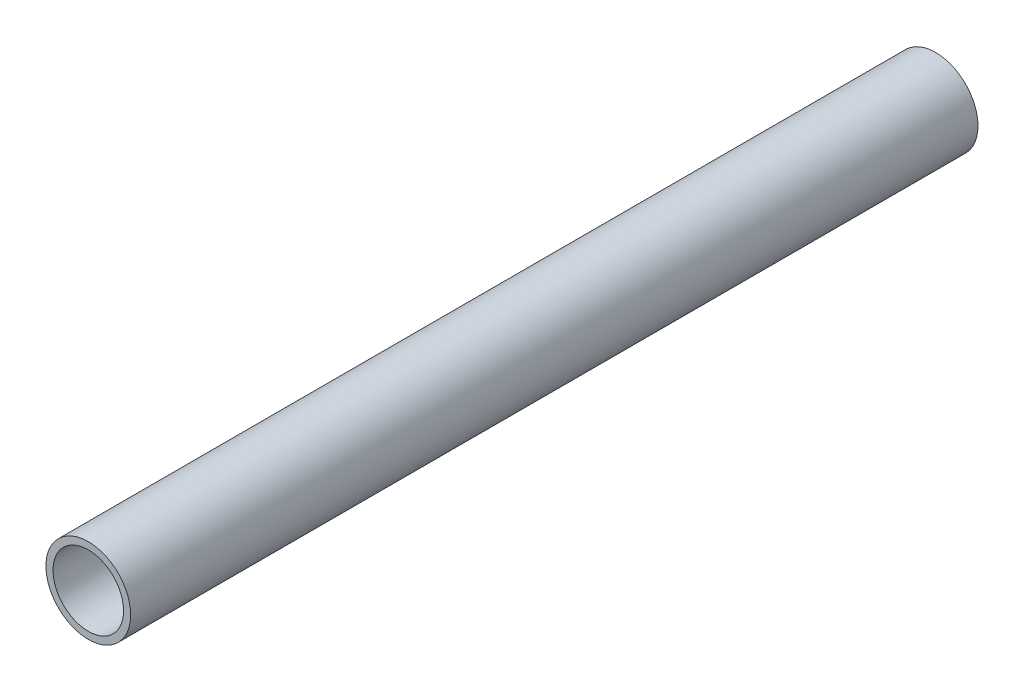
ISO-10303-21;
HEADER;
FILE_DESCRIPTION(('STEP AP214'),'2;1');
FILE_NAME('part.step','',(''),(''),'','','');
FILE_SCHEMA(('AUTOMOTIVE_DESIGN { 1 0 10303 214 1 1 1 1 }'));
ENDSEC;
DATA;
#1=APPLICATION_CONTEXT('core data for automotive mechanical design processes');
#2=APPLICATION_PROTOCOL_DEFINITION('international standard','automotive_design',2000,#1);
#3=PRODUCT_CONTEXT('',#1,'mechanical');
#4=PRODUCT('Part','Part','',(#3));
#5=PRODUCT_RELATED_PRODUCT_CATEGORY('part','',(#4));
#6=PRODUCT_DEFINITION_FORMATION('','',#4);
#7=PRODUCT_DEFINITION_CONTEXT('part definition',#1,'design');
#8=PRODUCT_DEFINITION('design','',#6,#7);
#9=PRODUCT_DEFINITION_SHAPE('','',#8);
#10=(LENGTH_UNIT() NAMED_UNIT(*) SI_UNIT(.MILLI.,.METRE.));
#11=(NAMED_UNIT(*) PLANE_ANGLE_UNIT() SI_UNIT($,.RADIAN.));
#12=(NAMED_UNIT(*) SI_UNIT($,.STERADIAN.) SOLID_ANGLE_UNIT());
#13=UNCERTAINTY_MEASURE_WITH_UNIT(LENGTH_MEASURE(1.E-05),#10,'distance_accuracy_value','');
#14=(GEOMETRIC_REPRESENTATION_CONTEXT(3) GLOBAL_UNCERTAINTY_ASSIGNED_CONTEXT((#13)) GLOBAL_UNIT_ASSIGNED_CONTEXT((#10,
#11,#12)) REPRESENTATION_CONTEXT('',''));
#15=CARTESIAN_POINT('',(0.,0.,0.));
#16=DIRECTION('',(0.,0.,1.));
#17=DIRECTION('',(1.,0.,0.));
#18=AXIS2_PLACEMENT_3D('',#15,#16,#17);
#19=CARTESIAN_POINT('',(63.2056093846233,81.64534440893,120.));
#20=DIRECTION('',(0.,0.,1.));
#21=DIRECTION('',(1.,0.,0.));
#22=AXIS2_PLACEMENT_3D('',#19,#20,#21);
#23=PLANE('',#22);
#24=CARTESIAN_POINT('',(63.2056093846233,81.64534440893,120.));
#25=DIRECTION('',(0.,0.,1.));
#26=DIRECTION('',(1.,0.,0.));
#27=AXIS2_PLACEMENT_3D('',#24,#25,#26);
#28=CIRCLE('',#27,6.);
#29=CARTESIAN_POINT('',(69.2056093846233,81.64534440893,120.));
#30=VERTEX_POINT('',#29);
#31=EDGE_CURVE('E10',#30,#30,#28,.T.);
#32=ORIENTED_EDGE('',*,*,#31,.T.);
#33=EDGE_LOOP('',(#32));
#34=FACE_BOUND('',#33,.T.);
#35=CARTESIAN_POINT('',(63.2056093846233,81.64534440893,120.));
#36=DIRECTION('',(0.,0.,1.));
#37=DIRECTION('',(1.,0.,0.));
#38=AXIS2_PLACEMENT_3D('',#35,#36,#37);
#39=CIRCLE('',#38,5.00000000000001);
#40=CARTESIAN_POINT('',(68.2056093846233,81.64534440893,120.));
#41=VERTEX_POINT('',#40);
#42=EDGE_CURVE('E43',#41,#41,#39,.T.);
#43=ORIENTED_EDGE('',*,*,#42,.F.);
#44=EDGE_LOOP('',(#43));
#45=FACE_BOUND('',#44,.T.);
#46=ADVANCED_FACE('F32',(#34,#45),#23,.T.);
#47=CARTESIAN_POINT('',(63.2056093846233,81.64534440893,0.));
#48=DIRECTION('',(0.,0.,1.));
#49=DIRECTION('',(1.,0.,0.));
#50=AXIS2_PLACEMENT_3D('',#47,#48,#49);
#51=PLANE('',#50);
#52=CARTESIAN_POINT('',(63.2056093846233,81.64534440893,0.));
#53=DIRECTION('',(0.,0.,1.));
#54=DIRECTION('',(1.,0.,0.));
#55=AXIS2_PLACEMENT_3D('',#52,#53,#54);
#56=CIRCLE('',#55,6.);
#57=CARTESIAN_POINT('',(69.2056093846233,81.64534440893,0.));
#58=VERTEX_POINT('',#57);
#59=EDGE_CURVE('E36',#58,#58,#56,.T.);
#60=ORIENTED_EDGE('',*,*,#59,.F.);
#61=EDGE_LOOP('',(#60));
#62=FACE_BOUND('',#61,.T.);
#63=CARTESIAN_POINT('',(63.2056093846233,81.64534440893,0.));
#64=DIRECTION('',(0.,0.,1.));
#65=DIRECTION('',(1.,0.,0.));
#66=AXIS2_PLACEMENT_3D('',#63,#64,#65);
#67=CIRCLE('',#66,5.00000000000001);
#68=CARTESIAN_POINT('',(68.2056093846233,81.64534440893,0.));
#69=VERTEX_POINT('',#68);
#70=EDGE_CURVE('E45',#69,#69,#67,.T.);
#71=ORIENTED_EDGE('',*,*,#70,.T.);
#72=EDGE_LOOP('',(#71));
#73=FACE_BOUND('',#72,.T.);
#74=ADVANCED_FACE('F55',(#62,#73),#51,.F.);
#75=CARTESIAN_POINT('',(63.2056093846233,81.64534440893,120.));
#76=DIRECTION('',(0.,0.,-1.));
#77=DIRECTION('',(-1.,0.,0.));
#78=AXIS2_PLACEMENT_3D('',#75,#76,#77);
#79=CYLINDRICAL_SURFACE('',#78,6.);
#80=ORIENTED_EDGE('',*,*,#31,.F.);
#81=EDGE_LOOP('',(#80));
#82=FACE_BOUND('',#81,.T.);
#83=ORIENTED_EDGE('',*,*,#59,.T.);
#84=EDGE_LOOP('',(#83));
#85=FACE_BOUND('',#84,.T.);
#86=ADVANCED_FACE('F34',(#82,#85),#79,.T.);
#87=CARTESIAN_POINT('',(63.2056093846233,81.64534440893,120.));
#88=DIRECTION('',(0.,0.,-1.));
#89=DIRECTION('',(-1.,0.,0.));
#90=AXIS2_PLACEMENT_3D('',#87,#88,#89);
#91=CYLINDRICAL_SURFACE('',#90,5.00000000000001);
#92=ORIENTED_EDGE('',*,*,#42,.T.);
#93=EDGE_LOOP('',(#92));
#94=FACE_BOUND('',#93,.T.);
#95=ORIENTED_EDGE('',*,*,#70,.F.);
#96=EDGE_LOOP('',(#95));
#97=FACE_BOUND('',#96,.T.);
#98=ADVANCED_FACE('F51',(#94,#97),#91,.F.);
#99=CLOSED_SHELL('',(#46,#74,#86,#98));
#100=MANIFOLD_SOLID_BREP('B2',#99);
#101=ADVANCED_BREP_SHAPE_REPRESENTATION('',(#18,#100),#14);
#102=SHAPE_DEFINITION_REPRESENTATION(#9,#101);
ENDSEC;
END-ISO-10303-21;
